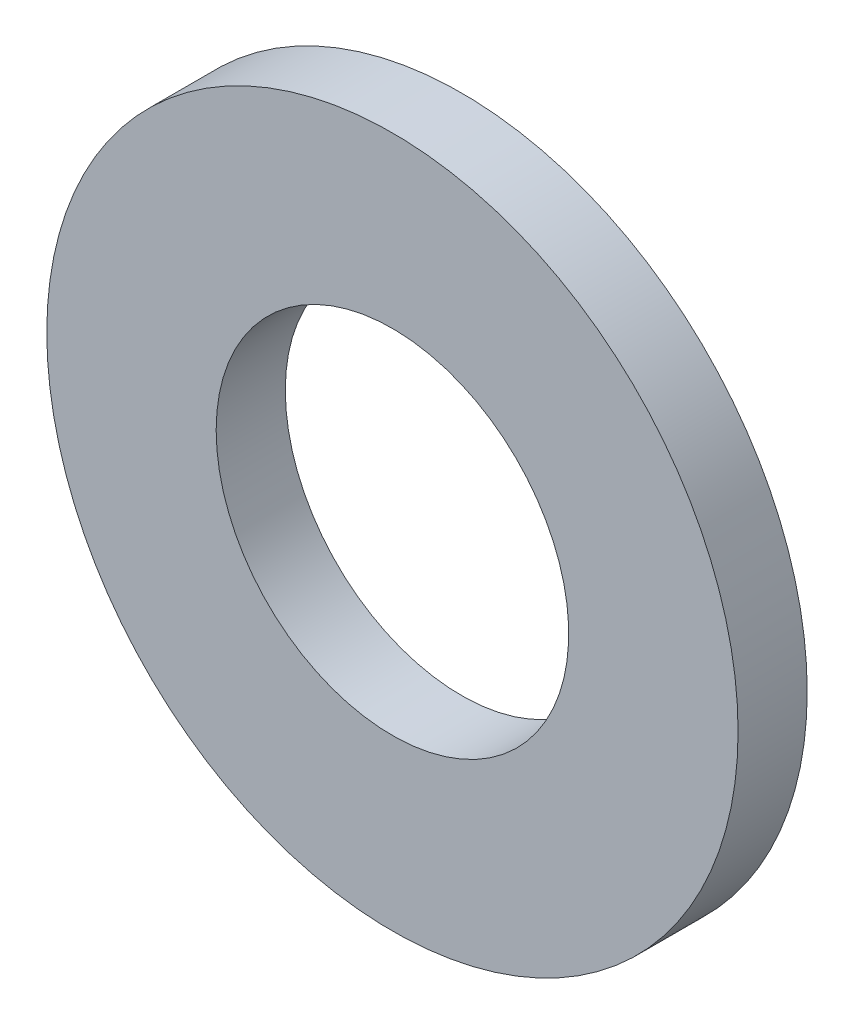
ISO-10303-21;
HEADER;
FILE_DESCRIPTION(('STEP AP214'),'2;1');
FILE_NAME('part.step','',(''),(''),'','','');
FILE_SCHEMA(('AUTOMOTIVE_DESIGN { 1 0 10303 214 1 1 1 1 }'));
ENDSEC;
DATA;
#1=APPLICATION_CONTEXT('core data for automotive mechanical design processes');
#2=APPLICATION_PROTOCOL_DEFINITION('international standard','automotive_design',2000,#1);
#3=PRODUCT_CONTEXT('',#1,'mechanical');
#4=PRODUCT('Part','Part','',(#3));
#5=PRODUCT_RELATED_PRODUCT_CATEGORY('part','',(#4));
#6=PRODUCT_DEFINITION_FORMATION('','',#4);
#7=PRODUCT_DEFINITION_CONTEXT('part definition',#1,'design');
#8=PRODUCT_DEFINITION('design','',#6,#7);
#9=PRODUCT_DEFINITION_SHAPE('','',#8);
#10=(LENGTH_UNIT() NAMED_UNIT(*) SI_UNIT(.MILLI.,.METRE.));
#11=(NAMED_UNIT(*) PLANE_ANGLE_UNIT() SI_UNIT($,.RADIAN.));
#12=(NAMED_UNIT(*) SI_UNIT($,.STERADIAN.) SOLID_ANGLE_UNIT());
#13=UNCERTAINTY_MEASURE_WITH_UNIT(LENGTH_MEASURE(1.E-05),#10,'distance_accuracy_value','');
#14=(GEOMETRIC_REPRESENTATION_CONTEXT(3) GLOBAL_UNCERTAINTY_ASSIGNED_CONTEXT((#13)) GLOBAL_UNIT_ASSIGNED_CONTEXT((#10,
#11,#12)) REPRESENTATION_CONTEXT('',''));
#15=CARTESIAN_POINT('',(0.,0.,0.));
#16=DIRECTION('',(0.,0.,1.));
#17=DIRECTION('',(1.,0.,0.));
#18=AXIS2_PLACEMENT_3D('',#15,#16,#17);
#19=CARTESIAN_POINT('',(0.,0.,0.));
#20=DIRECTION('',(0.,0.,1.));
#21=DIRECTION('',(1.,0.,0.));
#22=AXIS2_PLACEMENT_3D('',#19,#20,#21);
#23=PLANE('',#22);
#24=CARTESIAN_POINT('',(0.,0.,0.));
#25=DIRECTION('',(0.,0.,-1.));
#26=DIRECTION('',(-1.,0.,0.));
#27=AXIS2_PLACEMENT_3D('',#24,#25,#26);
#28=CIRCLE('',#27,2.55);
#29=CARTESIAN_POINT('',(-2.55,0.,0.));
#30=VERTEX_POINT('',#29);
#31=EDGE_CURVE('E26',#30,#30,#28,.F.);
#32=ORIENTED_EDGE('',*,*,#31,.T.);
#33=EDGE_LOOP('',(#32));
#34=FACE_BOUND('',#33,.T.);
#35=CARTESIAN_POINT('',(0.,0.,0.));
#36=DIRECTION('',(0.,0.,-1.));
#37=DIRECTION('',(-1.,0.,0.));
#38=AXIS2_PLACEMENT_3D('',#35,#36,#37);
#39=CIRCLE('',#38,5.);
#40=CARTESIAN_POINT('',(-5.,0.,0.));
#41=VERTEX_POINT('',#40);
#42=EDGE_CURVE('E17',#41,#41,#39,.F.);
#43=ORIENTED_EDGE('',*,*,#42,.F.);
#44=EDGE_LOOP('',(#43));
#45=FACE_BOUND('',#44,.T.);
#46=ADVANCED_FACE('F14',(#34,#45),#23,.F.);
#47=CARTESIAN_POINT('',(0.,0.,1.));
#48=DIRECTION('',(0.,0.,-1.));
#49=DIRECTION('',(-1.,0.,0.));
#50=AXIS2_PLACEMENT_3D('',#47,#48,#49);
#51=CYLINDRICAL_SURFACE('',#50,5.);
#52=ORIENTED_EDGE('',*,*,#42,.T.);
#53=EDGE_LOOP('',(#52));
#54=FACE_BOUND('',#53,.T.);
#55=CARTESIAN_POINT('',(0.,0.,1.));
#56=DIRECTION('',(0.,0.,-1.));
#57=DIRECTION('',(-1.,0.,0.));
#58=AXIS2_PLACEMENT_3D('',#55,#56,#57);
#59=CIRCLE('',#58,5.);
#60=CARTESIAN_POINT('',(-5.,0.,1.));
#61=VERTEX_POINT('',#60);
#62=EDGE_CURVE('E21',#61,#61,#59,.F.);
#63=ORIENTED_EDGE('',*,*,#62,.F.);
#64=EDGE_LOOP('',(#63));
#65=FACE_BOUND('',#64,.T.);
#66=ADVANCED_FACE('F34',(#54,#65),#51,.T.);
#67=CARTESIAN_POINT('',(0.,0.,1.));
#68=DIRECTION('',(0.,0.,-1.));
#69=DIRECTION('',(-1.,0.,0.));
#70=AXIS2_PLACEMENT_3D('',#67,#68,#69);
#71=CYLINDRICAL_SURFACE('',#70,2.55);
#72=CARTESIAN_POINT('',(0.,0.,1.));
#73=DIRECTION('',(0.,0.,-1.));
#74=DIRECTION('',(-1.,0.,0.));
#75=AXIS2_PLACEMENT_3D('',#72,#73,#74);
#76=CIRCLE('',#75,2.55);
#77=CARTESIAN_POINT('',(-2.55,0.,1.));
#78=VERTEX_POINT('',#77);
#79=EDGE_CURVE('E10',#78,#78,#76,.T.);
#80=ORIENTED_EDGE('',*,*,#79,.F.);
#81=EDGE_LOOP('',(#80));
#82=FACE_BOUND('',#81,.T.);
#83=ORIENTED_EDGE('',*,*,#31,.F.);
#84=EDGE_LOOP('',(#83));
#85=FACE_BOUND('',#84,.T.);
#86=ADVANCED_FACE('F42',(#82,#85),#71,.F.);
#87=CARTESIAN_POINT('',(0.,0.,1.));
#88=DIRECTION('',(0.,0.,1.));
#89=DIRECTION('',(1.,0.,0.));
#90=AXIS2_PLACEMENT_3D('',#87,#88,#89);
#91=PLANE('',#90);
#92=ORIENTED_EDGE('',*,*,#79,.T.);
#93=EDGE_LOOP('',(#92));
#94=FACE_BOUND('',#93,.T.);
#95=ORIENTED_EDGE('',*,*,#62,.T.);
#96=EDGE_LOOP('',(#95));
#97=FACE_BOUND('',#96,.T.);
#98=ADVANCED_FACE('F43',(#94,#97),#91,.T.);
#99=CLOSED_SHELL('',(#46,#66,#86,#98));
#100=MANIFOLD_SOLID_BREP('B1',#99);
#101=ADVANCED_BREP_SHAPE_REPRESENTATION('',(#18,#100),#14);
#102=SHAPE_DEFINITION_REPRESENTATION(#9,#101);
ENDSEC;
END-ISO-10303-21;
